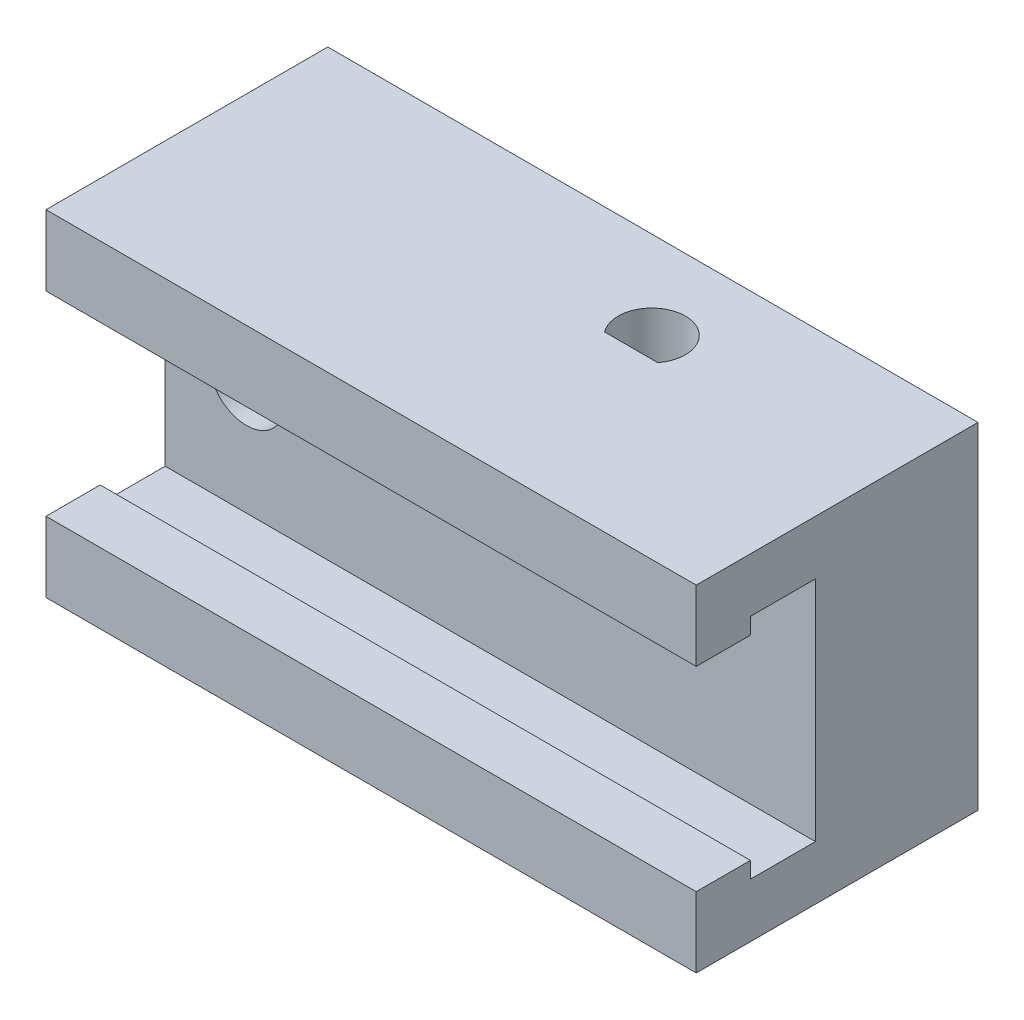
ISO-10303-21;
HEADER;
FILE_DESCRIPTION(('STEP AP214'),'2;1');
FILE_NAME('part.step','',(''),(''),'','','');
FILE_SCHEMA(('AUTOMOTIVE_DESIGN { 1 0 10303 214 1 1 1 1 }'));
ENDSEC;
DATA;
#1=APPLICATION_CONTEXT('core data for automotive mechanical design processes');
#2=APPLICATION_PROTOCOL_DEFINITION('international standard','automotive_design',2000,#1);
#3=PRODUCT_CONTEXT('',#1,'mechanical');
#4=PRODUCT('Part','Part','',(#3));
#5=PRODUCT_RELATED_PRODUCT_CATEGORY('part','',(#4));
#6=PRODUCT_DEFINITION_FORMATION('','',#4);
#7=PRODUCT_DEFINITION_CONTEXT('part definition',#1,'design');
#8=PRODUCT_DEFINITION('design','',#6,#7);
#9=PRODUCT_DEFINITION_SHAPE('','',#8);
#10=(LENGTH_UNIT() NAMED_UNIT(*) SI_UNIT(.MILLI.,.METRE.));
#11=(NAMED_UNIT(*) PLANE_ANGLE_UNIT() SI_UNIT($,.RADIAN.));
#12=(NAMED_UNIT(*) SI_UNIT($,.STERADIAN.) SOLID_ANGLE_UNIT());
#13=UNCERTAINTY_MEASURE_WITH_UNIT(LENGTH_MEASURE(1.E-05),#10,'distance_accuracy_value','');
#14=(GEOMETRIC_REPRESENTATION_CONTEXT(3) GLOBAL_UNCERTAINTY_ASSIGNED_CONTEXT((#13)) GLOBAL_UNIT_ASSIGNED_CONTEXT((#10,
#11,#12)) REPRESENTATION_CONTEXT('',''));
#15=CARTESIAN_POINT('',(0.,0.,0.));
#16=DIRECTION('',(0.,0.,1.));
#17=DIRECTION('',(1.,0.,0.));
#18=AXIS2_PLACEMENT_3D('',#15,#16,#17);
#19=CARTESIAN_POINT('',(-19.,15.5,8.95));
#20=DIRECTION('',(0.,0.,-1.));
#21=DIRECTION('',(-1.,0.,0.));
#22=AXIS2_PLACEMENT_3D('',#19,#20,#21);
#23=PLANE('',#22);
#24=DIRECTION('',(0.,-1.,0.));
#25=VECTOR('',#24,1.);
#26=CARTESIAN_POINT('',(11.,15.5,8.95));
#27=LINE('',#26,#25);
#28=CARTESIAN_POINT('',(11.,3.25,8.95));
#29=VERTEX_POINT('',#28);
#30=CARTESIAN_POINT('',(11.,0.,8.95));
#31=VERTEX_POINT('',#30);
#32=EDGE_CURVE('E167',#29,#31,#27,.T.);
#33=ORIENTED_EDGE('',*,*,#32,.F.);
#34=DIRECTION('',(-1.,0.,0.));
#35=VECTOR('',#34,1.);
#36=CARTESIAN_POINT('',(11.,3.25,8.95));
#37=LINE('',#36,#35);
#38=CARTESIAN_POINT('',(-19.,3.25,8.95));
#39=VERTEX_POINT('',#38);
#40=EDGE_CURVE('E222',#29,#39,#37,.T.);
#41=ORIENTED_EDGE('',*,*,#40,.T.);
#42=DIRECTION('',(0.,-1.,0.));
#43=VECTOR('',#42,1.);
#44=CARTESIAN_POINT('',(-19.,15.5,8.95));
#45=LINE('',#44,#43);
#46=CARTESIAN_POINT('',(-19.,0.,8.95));
#47=VERTEX_POINT('',#46);
#48=EDGE_CURVE('E49',#39,#47,#45,.T.);
#49=ORIENTED_EDGE('',*,*,#48,.T.);
#50=DIRECTION('',(1.,0.,0.));
#51=VECTOR('',#50,1.);
#52=CARTESIAN_POINT('',(-19.,0.,8.95));
#53=LINE('',#52,#51);
#54=EDGE_CURVE('E188',#47,#31,#53,.T.);
#55=ORIENTED_EDGE('',*,*,#54,.T.);
#56=EDGE_LOOP('',(#33,#41,#49,#55));
#57=FACE_BOUND('',#56,.T.);
#58=ADVANCED_FACE('F39',(#57),#23,.F.);
#59=CARTESIAN_POINT('',(0.,15.5,0.));
#60=DIRECTION('',(0.,1.,0.));
#61=DIRECTION('',(0.,0.,1.));
#62=AXIS2_PLACEMENT_3D('',#59,#60,#61);
#63=PLANE('',#62);
#64=DIRECTION('',(0.,0.,1.));
#65=VECTOR('',#64,1.);
#66=CARTESIAN_POINT('',(-19.,15.5,-4.05));
#67=LINE('',#66,#65);
#68=CARTESIAN_POINT('',(-19.,15.5,-4.05));
#69=VERTEX_POINT('',#68);
#70=CARTESIAN_POINT('',(-19.,15.5,8.95));
#71=VERTEX_POINT('',#70);
#72=EDGE_CURVE('E184',#69,#71,#67,.T.);
#73=ORIENTED_EDGE('',*,*,#72,.T.);
#74=DIRECTION('',(1.,0.,0.));
#75=VECTOR('',#74,1.);
#76=CARTESIAN_POINT('',(-19.,15.5,8.95));
#77=LINE('',#76,#75);
#78=CARTESIAN_POINT('',(11.,15.5,8.95));
#79=VERTEX_POINT('',#78);
#80=EDGE_CURVE('E200',#71,#79,#77,.T.);
#81=ORIENTED_EDGE('',*,*,#80,.T.);
#82=DIRECTION('',(0.,0.,-1.));
#83=VECTOR('',#82,1.);
#84=CARTESIAN_POINT('',(11.,15.5,-4.05));
#85=LINE('',#84,#83);
#86=CARTESIAN_POINT('',(11.,15.5,-4.05));
#87=VERTEX_POINT('',#86);
#88=EDGE_CURVE('E165',#79,#87,#85,.T.);
#89=ORIENTED_EDGE('',*,*,#88,.T.);
#90=DIRECTION('',(-1.,0.,0.));
#91=VECTOR('',#90,1.);
#92=CARTESIAN_POINT('',(-19.,15.5,-4.05));
#93=LINE('',#92,#91);
#94=EDGE_CURVE('E180',#87,#69,#93,.T.);
#95=ORIENTED_EDGE('',*,*,#94,.T.);
#96=EDGE_LOOP('',(#73,#81,#89,#95));
#97=FACE_BOUND('',#96,.T.);
#98=DIRECTION('',(1.,0.,0.));
#99=VECTOR('',#98,1.);
#100=CARTESIAN_POINT('',(-1.22474487139159,15.5,0.95));
#101=LINE('',#100,#99);
#102=CARTESIAN_POINT('',(-1.22474487139159,15.5,0.95));
#103=VERTEX_POINT('',#102);
#104=CARTESIAN_POINT('',(1.22474487139159,15.5,0.95));
#105=VERTEX_POINT('',#104);
#106=EDGE_CURVE('E212',#103,#105,#101,.T.);
#107=ORIENTED_EDGE('',*,*,#106,.F.);
#108=CARTESIAN_POINT('',(0.,15.5,0.));
#109=DIRECTION('',(0.,1.,0.));
#110=DIRECTION('',(0.,0.,1.));
#111=AXIS2_PLACEMENT_3D('',#108,#109,#110);
#112=CIRCLE('',#111,1.55);
#113=EDGE_CURVE('E217',#105,#103,#112,.T.);
#114=ORIENTED_EDGE('',*,*,#113,.F.);
#115=EDGE_LOOP('',(#107,#114));
#116=FACE_BOUND('',#115,.T.);
#117=ADVANCED_FACE('F314',(#97,#116),#63,.T.);
#118=CARTESIAN_POINT('',(0.,0.,0.));
#119=DIRECTION('',(0.,1.,0.));
#120=DIRECTION('',(0.,0.,1.));
#121=AXIS2_PLACEMENT_3D('',#118,#119,#120);
#122=PLANE('',#121);
#123=DIRECTION('',(0.,0.,1.));
#124=VECTOR('',#123,1.);
#125=CARTESIAN_POINT('',(-19.,0.,-4.05));
#126=LINE('',#125,#124);
#127=CARTESIAN_POINT('',(-19.,0.,-4.05));
#128=VERTEX_POINT('',#127);
#129=EDGE_CURVE('E192',#128,#47,#126,.T.);
#130=ORIENTED_EDGE('',*,*,#129,.F.);
#131=DIRECTION('',(-1.,0.,0.));
#132=VECTOR('',#131,1.);
#133=CARTESIAN_POINT('',(-19.,0.,-4.05));
#134=LINE('',#133,#132);
#135=CARTESIAN_POINT('',(11.,0.,-4.05));
#136=VERTEX_POINT('',#135);
#137=EDGE_CURVE('E181',#136,#128,#134,.T.);
#138=ORIENTED_EDGE('',*,*,#137,.F.);
#139=DIRECTION('',(0.,0.,-1.));
#140=VECTOR('',#139,1.);
#141=CARTESIAN_POINT('',(11.,0.,-4.05));
#142=LINE('',#141,#140);
#143=EDGE_CURVE('E185',#31,#136,#142,.T.);
#144=ORIENTED_EDGE('',*,*,#143,.F.);
#145=ORIENTED_EDGE('',*,*,#54,.F.);
#146=EDGE_LOOP('',(#130,#138,#144,#145));
#147=FACE_BOUND('',#146,.T.);
#148=CARTESIAN_POINT('',(0.,0.,0.));
#149=DIRECTION('',(0.,1.,0.));
#150=DIRECTION('',(0.,0.,1.));
#151=AXIS2_PLACEMENT_3D('',#148,#149,#150);
#152=CIRCLE('',#151,1.55);
#153=CARTESIAN_POINT('',(1.22474487139159,0.,0.95));
#154=VERTEX_POINT('',#153);
#155=CARTESIAN_POINT('',(-1.22474487139159,0.,0.95));
#156=VERTEX_POINT('',#155);
#157=EDGE_CURVE('E218',#154,#156,#152,.T.);
#158=ORIENTED_EDGE('',*,*,#157,.T.);
#159=DIRECTION('',(1.,0.,0.));
#160=VECTOR('',#159,1.);
#161=CARTESIAN_POINT('',(-1.22474487139159,0.,0.95));
#162=LINE('',#161,#160);
#163=EDGE_CURVE('E213',#156,#154,#162,.T.);
#164=ORIENTED_EDGE('',*,*,#163,.T.);
#165=EDGE_LOOP('',(#158,#164));
#166=FACE_BOUND('',#165,.T.);
#167=ADVANCED_FACE('F319',(#147,#166),#122,.F.);
#168=CARTESIAN_POINT('',(-19.,15.5,-4.05));
#169=DIRECTION('',(1.,0.,0.));
#170=DIRECTION('',(0.,0.,-1.));
#171=AXIS2_PLACEMENT_3D('',#168,#169,#170);
#172=PLANE('',#171);
#173=ORIENTED_EDGE('',*,*,#48,.F.);
#174=DIRECTION('',(0.,0.,1.));
#175=VECTOR('',#174,1.);
#176=CARTESIAN_POINT('',(-19.,3.25,6.45));
#177=LINE('',#176,#175);
#178=CARTESIAN_POINT('',(-19.,3.25,6.45));
#179=VERTEX_POINT('',#178);
#180=EDGE_CURVE('E151',#179,#39,#177,.T.);
#181=ORIENTED_EDGE('',*,*,#180,.F.);
#182=DIRECTION('',(0.,1.,0.));
#183=VECTOR('',#182,1.);
#184=CARTESIAN_POINT('',(-19.,2.5,6.45));
#185=LINE('',#184,#183);
#186=CARTESIAN_POINT('',(-19.,2.5,6.45));
#187=VERTEX_POINT('',#186);
#188=EDGE_CURVE('E249',#187,#179,#185,.T.);
#189=ORIENTED_EDGE('',*,*,#188,.F.);
#190=DIRECTION('',(0.,0.,1.));
#191=VECTOR('',#190,1.);
#192=CARTESIAN_POINT('',(-19.,2.5,3.45));
#193=LINE('',#192,#191);
#194=CARTESIAN_POINT('',(-19.,2.5,3.45));
#195=VERTEX_POINT('',#194);
#196=EDGE_CURVE('E253',#195,#187,#193,.T.);
#197=ORIENTED_EDGE('',*,*,#196,.F.);
#198=DIRECTION('',(0.,-1.,0.));
#199=VECTOR('',#198,1.);
#200=CARTESIAN_POINT('',(-19.,13.,3.45));
#201=LINE('',#200,#199);
#202=CARTESIAN_POINT('',(-19.,13.,3.45));
#203=VERTEX_POINT('',#202);
#204=EDGE_CURVE('E257',#203,#195,#201,.T.);
#205=ORIENTED_EDGE('',*,*,#204,.F.);
#206=DIRECTION('',(0.,0.,-1.));
#207=VECTOR('',#206,1.);
#208=CARTESIAN_POINT('',(-19.,13.,6.45));
#209=LINE('',#208,#207);
#210=CARTESIAN_POINT('',(-19.,13.,6.45));
#211=VERTEX_POINT('',#210);
#212=EDGE_CURVE('E261',#211,#203,#209,.T.);
#213=ORIENTED_EDGE('',*,*,#212,.F.);
#214=DIRECTION('',(0.,1.,0.));
#215=VECTOR('',#214,1.);
#216=CARTESIAN_POINT('',(-19.,12.25,6.45));
#217=LINE('',#216,#215);
#218=CARTESIAN_POINT('',(-19.,12.25,6.45));
#219=VERTEX_POINT('',#218);
#220=EDGE_CURVE('E265',#219,#211,#217,.T.);
#221=ORIENTED_EDGE('',*,*,#220,.F.);
#222=DIRECTION('',(0.,0.,-1.));
#223=VECTOR('',#222,1.);
#224=CARTESIAN_POINT('',(-19.,12.25,8.94999999999999));
#225=LINE('',#224,#223);
#226=CARTESIAN_POINT('',(-19.,12.25,8.94999999999999));
#227=VERTEX_POINT('',#226);
#228=EDGE_CURVE('E269',#227,#219,#225,.T.);
#229=ORIENTED_EDGE('',*,*,#228,.F.);
#230=EDGE_CURVE('E11',#71,#227,#45,.T.);
#231=ORIENTED_EDGE('',*,*,#230,.F.);
#232=ORIENTED_EDGE('',*,*,#72,.F.);
#233=DIRECTION('',(0.,-1.,0.));
#234=VECTOR('',#233,1.);
#235=CARTESIAN_POINT('',(-19.,15.5,-4.05));
#236=LINE('',#235,#234);
#237=EDGE_CURVE('E176',#69,#128,#236,.T.);
#238=ORIENTED_EDGE('',*,*,#237,.T.);
#239=ORIENTED_EDGE('',*,*,#129,.T.);
#240=EDGE_LOOP('',(#173,#181,#189,#197,#205,#213,#221,#229,#231,#232,#238,#239));
#241=FACE_BOUND('',#240,.T.);
#242=ADVANCED_FACE('F41',(#241),#172,.F.);
#243=ORIENTED_EDGE('',*,*,#230,.T.);
#244=DIRECTION('',(-1.,0.,0.));
#245=VECTOR('',#244,1.);
#246=CARTESIAN_POINT('',(11.,12.25,8.94999999999999));
#247=LINE('',#246,#245);
#248=CARTESIAN_POINT('',(11.,12.25,8.94999999999999));
#249=VERTEX_POINT('',#248);
#250=EDGE_CURVE('E145',#249,#227,#247,.T.);
#251=ORIENTED_EDGE('',*,*,#250,.F.);
#252=EDGE_CURVE('E156',#79,#249,#27,.T.);
#253=ORIENTED_EDGE('',*,*,#252,.F.);
#254=ORIENTED_EDGE('',*,*,#80,.F.);
#255=EDGE_LOOP('',(#243,#251,#253,#254));
#256=FACE_BOUND('',#255,.T.);
#257=ADVANCED_FACE('F155',(#256),#23,.F.);
#258=CARTESIAN_POINT('',(11.,15.5,-4.05));
#259=DIRECTION('',(-1.,0.,0.));
#260=DIRECTION('',(0.,0.,1.));
#261=AXIS2_PLACEMENT_3D('',#258,#259,#260);
#262=PLANE('',#261);
#263=DIRECTION('',(0.,1.,0.));
#264=VECTOR('',#263,1.);
#265=CARTESIAN_POINT('',(11.,2.5,6.45));
#266=LINE('',#265,#264);
#267=CARTESIAN_POINT('',(11.,2.5,6.45));
#268=VERTEX_POINT('',#267);
#269=CARTESIAN_POINT('',(11.,3.25,6.45));
#270=VERTEX_POINT('',#269);
#271=EDGE_CURVE('E275',#268,#270,#266,.T.);
#272=ORIENTED_EDGE('',*,*,#271,.T.);
#273=DIRECTION('',(0.,0.,1.));
#274=VECTOR('',#273,1.);
#275=CARTESIAN_POINT('',(11.,3.25,6.45));
#276=LINE('',#275,#274);
#277=EDGE_CURVE('E160',#270,#29,#276,.T.);
#278=ORIENTED_EDGE('',*,*,#277,.T.);
#279=ORIENTED_EDGE('',*,*,#32,.T.);
#280=ORIENTED_EDGE('',*,*,#143,.T.);
#281=DIRECTION('',(0.,-1.,0.));
#282=VECTOR('',#281,1.);
#283=CARTESIAN_POINT('',(11.,15.5,-4.05));
#284=LINE('',#283,#282);
#285=EDGE_CURVE('E171',#87,#136,#284,.T.);
#286=ORIENTED_EDGE('',*,*,#285,.F.);
#287=ORIENTED_EDGE('',*,*,#88,.F.);
#288=ORIENTED_EDGE('',*,*,#252,.T.);
#289=DIRECTION('',(0.,0.,-1.));
#290=VECTOR('',#289,1.);
#291=CARTESIAN_POINT('',(11.,12.25,8.94999999999999));
#292=LINE('',#291,#290);
#293=CARTESIAN_POINT('',(11.,12.25,6.45));
#294=VERTEX_POINT('',#293);
#295=EDGE_CURVE('E141',#249,#294,#292,.T.);
#296=ORIENTED_EDGE('',*,*,#295,.T.);
#297=DIRECTION('',(0.,1.,0.));
#298=VECTOR('',#297,1.);
#299=CARTESIAN_POINT('',(11.,12.25,6.45));
#300=LINE('',#299,#298);
#301=CARTESIAN_POINT('',(11.,13.,6.45));
#302=VERTEX_POINT('',#301);
#303=EDGE_CURVE('E56',#294,#302,#300,.T.);
#304=ORIENTED_EDGE('',*,*,#303,.T.);
#305=DIRECTION('',(0.,0.,-1.));
#306=VECTOR('',#305,1.);
#307=CARTESIAN_POINT('',(11.,13.,6.45));
#308=LINE('',#307,#306);
#309=CARTESIAN_POINT('',(11.,13.,3.45));
#310=VERTEX_POINT('',#309);
#311=EDGE_CURVE('E286',#302,#310,#308,.T.);
#312=ORIENTED_EDGE('',*,*,#311,.T.);
#313=DIRECTION('',(0.,-1.,0.));
#314=VECTOR('',#313,1.);
#315=CARTESIAN_POINT('',(11.,13.,3.45));
#316=LINE('',#315,#314);
#317=CARTESIAN_POINT('',(11.,2.5,3.45));
#318=VERTEX_POINT('',#317);
#319=EDGE_CURVE('E282',#310,#318,#316,.T.);
#320=ORIENTED_EDGE('',*,*,#319,.T.);
#321=DIRECTION('',(0.,0.,1.));
#322=VECTOR('',#321,1.);
#323=CARTESIAN_POINT('',(11.,2.5,3.45));
#324=LINE('',#323,#322);
#325=EDGE_CURVE('E278',#318,#268,#324,.T.);
#326=ORIENTED_EDGE('',*,*,#325,.T.);
#327=EDGE_LOOP('',(#272,#278,#279,#280,#286,#287,#288,#296,#304,#312,#320,#326));
#328=FACE_BOUND('',#327,.T.);
#329=ADVANCED_FACE('F163',(#328),#262,.F.);
#330=CARTESIAN_POINT('',(-19.,15.5,-4.05));
#331=DIRECTION('',(0.,0.,1.));
#332=DIRECTION('',(1.,0.,0.));
#333=AXIS2_PLACEMENT_3D('',#330,#331,#332);
#334=PLANE('',#333);
#335=CARTESIAN_POINT('',(-15.25,7.75,-4.05));
#336=DIRECTION('',(0.,0.,-1.));
#337=DIRECTION('',(-1.,0.,0.));
#338=AXIS2_PLACEMENT_3D('',#335,#336,#337);
#339=CIRCLE('',#338,1.75);
#340=CARTESIAN_POINT('',(-17.,7.75,-4.05));
#341=VERTEX_POINT('',#340);
#342=EDGE_CURVE('E292',#341,#341,#339,.T.);
#343=ORIENTED_EDGE('',*,*,#342,.F.);
#344=EDGE_LOOP('',(#343));
#345=FACE_BOUND('',#344,.T.);
#346=ORIENTED_EDGE('',*,*,#137,.T.);
#347=ORIENTED_EDGE('',*,*,#237,.F.);
#348=ORIENTED_EDGE('',*,*,#94,.F.);
#349=ORIENTED_EDGE('',*,*,#285,.T.);
#350=EDGE_LOOP('',(#346,#347,#348,#349));
#351=FACE_BOUND('',#350,.T.);
#352=ADVANCED_FACE('F329',(#345,#351),#334,.F.);
#353=CARTESIAN_POINT('',(0.,15.5,0.));
#354=DIRECTION('',(0.,-1.,0.));
#355=DIRECTION('',(0.,0.,-1.));
#356=AXIS2_PLACEMENT_3D('',#353,#354,#355);
#357=CYLINDRICAL_SURFACE('',#356,1.55);
#358=ORIENTED_EDGE('',*,*,#157,.F.);
#359=DIRECTION('',(0.,-1.,0.));
#360=VECTOR('',#359,1.);
#361=CARTESIAN_POINT('',(1.22474487139159,15.5,0.95));
#362=LINE('',#361,#360);
#363=EDGE_CURVE('E208',#105,#154,#362,.T.);
#364=ORIENTED_EDGE('',*,*,#363,.F.);
#365=ORIENTED_EDGE('',*,*,#113,.T.);
#366=DIRECTION('',(0.,-1.,0.));
#367=VECTOR('',#366,1.);
#368=CARTESIAN_POINT('',(-1.22474487139159,15.5,0.95));
#369=LINE('',#368,#367);
#370=EDGE_CURVE('E64',#103,#156,#369,.T.);
#371=ORIENTED_EDGE('',*,*,#370,.T.);
#372=EDGE_LOOP('',(#358,#364,#365,#371));
#373=FACE_BOUND('',#372,.T.);
#374=ADVANCED_FACE('F373',(#373),#357,.F.);
#375=CARTESIAN_POINT('',(-1.22474487139159,15.5,0.95));
#376=DIRECTION('',(0.,0.,-1.));
#377=DIRECTION('',(-1.,0.,0.));
#378=AXIS2_PLACEMENT_3D('',#375,#376,#377);
#379=PLANE('',#378);
#380=ORIENTED_EDGE('',*,*,#163,.F.);
#381=ORIENTED_EDGE('',*,*,#370,.F.);
#382=ORIENTED_EDGE('',*,*,#106,.T.);
#383=ORIENTED_EDGE('',*,*,#363,.T.);
#384=EDGE_LOOP('',(#380,#381,#382,#383));
#385=FACE_BOUND('',#384,.T.);
#386=ADVANCED_FACE('F367',(#385),#379,.T.);
#387=CARTESIAN_POINT('',(11.,3.25,6.45));
#388=DIRECTION('',(0.,-1.,0.));
#389=DIRECTION('',(0.,0.,-1.));
#390=AXIS2_PLACEMENT_3D('',#387,#388,#389);
#391=PLANE('',#390);
#392=ORIENTED_EDGE('',*,*,#180,.T.);
#393=ORIENTED_EDGE('',*,*,#40,.F.);
#394=ORIENTED_EDGE('',*,*,#277,.F.);
#395=DIRECTION('',(-1.,0.,0.));
#396=VECTOR('',#395,1.);
#397=CARTESIAN_POINT('',(11.,3.25,6.45));
#398=LINE('',#397,#396);
#399=EDGE_CURVE('E241',#270,#179,#398,.T.);
#400=ORIENTED_EDGE('',*,*,#399,.T.);
#401=EDGE_LOOP('',(#392,#393,#394,#400));
#402=FACE_BOUND('',#401,.T.);
#403=ADVANCED_FACE('F365',(#402),#391,.F.);
#404=CARTESIAN_POINT('',(11.,2.5,6.45));
#405=DIRECTION('',(0.,0.,1.));
#406=DIRECTION('',(1.,0.,0.));
#407=AXIS2_PLACEMENT_3D('',#404,#405,#406);
#408=PLANE('',#407);
#409=ORIENTED_EDGE('',*,*,#188,.T.);
#410=ORIENTED_EDGE('',*,*,#399,.F.);
#411=ORIENTED_EDGE('',*,*,#271,.F.);
#412=DIRECTION('',(-1.,0.,0.));
#413=VECTOR('',#412,1.);
#414=CARTESIAN_POINT('',(11.,2.5,6.45));
#415=LINE('',#414,#413);
#416=EDGE_CURVE('E238',#268,#187,#415,.T.);
#417=ORIENTED_EDGE('',*,*,#416,.T.);
#418=EDGE_LOOP('',(#409,#410,#411,#417));
#419=FACE_BOUND('',#418,.T.);
#420=ADVANCED_FACE('F362',(#419),#408,.F.);
#421=CARTESIAN_POINT('',(11.,2.5,3.45));
#422=DIRECTION('',(0.,-1.,0.));
#423=DIRECTION('',(0.,0.,-1.));
#424=AXIS2_PLACEMENT_3D('',#421,#422,#423);
#425=PLANE('',#424);
#426=ORIENTED_EDGE('',*,*,#196,.T.);
#427=ORIENTED_EDGE('',*,*,#416,.F.);
#428=ORIENTED_EDGE('',*,*,#325,.F.);
#429=DIRECTION('',(-1.,0.,0.));
#430=VECTOR('',#429,1.);
#431=CARTESIAN_POINT('',(11.,2.5,3.45));
#432=LINE('',#431,#430);
#433=EDGE_CURVE('E235',#318,#195,#432,.T.);
#434=ORIENTED_EDGE('',*,*,#433,.T.);
#435=EDGE_LOOP('',(#426,#427,#428,#434));
#436=FACE_BOUND('',#435,.T.);
#437=ADVANCED_FACE('F359',(#436),#425,.F.);
#438=CARTESIAN_POINT('',(11.,13.,3.45));
#439=DIRECTION('',(0.,0.,-1.));
#440=DIRECTION('',(0.,1.,0.));
#441=AXIS2_PLACEMENT_3D('',#438,#439,#440);
#442=PLANE('',#441);
#443=CARTESIAN_POINT('',(-15.25,7.75,3.45));
#444=DIRECTION('',(0.,0.,-1.));
#445=DIRECTION('',(0.,1.,0.));
#446=AXIS2_PLACEMENT_3D('',#443,#444,#445);
#447=CIRCLE('',#446,1.75);
#448=CARTESIAN_POINT('',(-15.25,9.5,3.45));
#449=VERTEX_POINT('',#448);
#450=EDGE_CURVE('E43',#449,#449,#447,.T.);
#451=ORIENTED_EDGE('',*,*,#450,.T.);
#452=EDGE_LOOP('',(#451));
#453=FACE_BOUND('',#452,.T.);
#454=ORIENTED_EDGE('',*,*,#204,.T.);
#455=ORIENTED_EDGE('',*,*,#433,.F.);
#456=ORIENTED_EDGE('',*,*,#319,.F.);
#457=DIRECTION('',(-1.,0.,0.));
#458=VECTOR('',#457,1.);
#459=CARTESIAN_POINT('',(11.,13.,3.45));
#460=LINE('',#459,#458);
#461=EDGE_CURVE('E232',#310,#203,#460,.T.);
#462=ORIENTED_EDGE('',*,*,#461,.T.);
#463=EDGE_LOOP('',(#454,#455,#456,#462));
#464=FACE_BOUND('',#463,.T.);
#465=ADVANCED_FACE('F301',(#453,#464),#442,.F.);
#466=CARTESIAN_POINT('',(11.,13.,6.45));
#467=DIRECTION('',(0.,1.,0.));
#468=DIRECTION('',(0.,0.,1.));
#469=AXIS2_PLACEMENT_3D('',#466,#467,#468);
#470=PLANE('',#469);
#471=ORIENTED_EDGE('',*,*,#212,.T.);
#472=ORIENTED_EDGE('',*,*,#461,.F.);
#473=ORIENTED_EDGE('',*,*,#311,.F.);
#474=DIRECTION('',(-1.,0.,0.));
#475=VECTOR('',#474,1.);
#476=CARTESIAN_POINT('',(11.,13.,6.45));
#477=LINE('',#476,#475);
#478=EDGE_CURVE('E229',#302,#211,#477,.T.);
#479=ORIENTED_EDGE('',*,*,#478,.T.);
#480=EDGE_LOOP('',(#471,#472,#473,#479));
#481=FACE_BOUND('',#480,.T.);
#482=ADVANCED_FACE('F354',(#481),#470,.F.);
#483=CARTESIAN_POINT('',(11.,12.25,6.45));
#484=DIRECTION('',(0.,0.,1.));
#485=DIRECTION('',(0.,-1.,0.));
#486=AXIS2_PLACEMENT_3D('',#483,#484,#485);
#487=PLANE('',#486);
#488=ORIENTED_EDGE('',*,*,#220,.T.);
#489=ORIENTED_EDGE('',*,*,#478,.F.);
#490=ORIENTED_EDGE('',*,*,#303,.F.);
#491=DIRECTION('',(-1.,0.,0.));
#492=VECTOR('',#491,1.);
#493=CARTESIAN_POINT('',(11.,12.25,6.45));
#494=LINE('',#493,#492);
#495=EDGE_CURVE('E147',#294,#219,#494,.T.);
#496=ORIENTED_EDGE('',*,*,#495,.T.);
#497=EDGE_LOOP('',(#488,#489,#490,#496));
#498=FACE_BOUND('',#497,.T.);
#499=ADVANCED_FACE('F310',(#498),#487,.F.);
#500=CARTESIAN_POINT('',(11.,12.25,8.94999999999999));
#501=DIRECTION('',(0.,1.,0.));
#502=DIRECTION('',(0.,0.,1.));
#503=AXIS2_PLACEMENT_3D('',#500,#501,#502);
#504=PLANE('',#503);
#505=ORIENTED_EDGE('',*,*,#228,.T.);
#506=ORIENTED_EDGE('',*,*,#495,.F.);
#507=ORIENTED_EDGE('',*,*,#295,.F.);
#508=ORIENTED_EDGE('',*,*,#250,.T.);
#509=EDGE_LOOP('',(#505,#506,#507,#508));
#510=FACE_BOUND('',#509,.T.);
#511=ADVANCED_FACE('F144',(#510),#504,.F.);
#512=CARTESIAN_POINT('',(-15.25,7.75,8.95));
#513=DIRECTION('',(0.,0.,-1.));
#514=DIRECTION('',(-1.,0.,0.));
#515=AXIS2_PLACEMENT_3D('',#512,#513,#514);
#516=CYLINDRICAL_SURFACE('',#515,1.75);
#517=ORIENTED_EDGE('',*,*,#342,.T.);
#518=EDGE_LOOP('',(#517));
#519=FACE_BOUND('',#518,.T.);
#520=ORIENTED_EDGE('',*,*,#450,.F.);
#521=EDGE_LOOP('',(#520));
#522=FACE_BOUND('',#521,.T.);
#523=ADVANCED_FACE('F304',(#519,#522),#516,.F.);
#524=CLOSED_SHELL('',(#58,#117,#167,#242,#257,#329,#352,#374,#386,#403,#420,#437,#465,#482,#499,
#511,#523));
#525=MANIFOLD_SOLID_BREP('B2',#524);
#526=ADVANCED_BREP_SHAPE_REPRESENTATION('',(#18,#525),#14);
#527=SHAPE_DEFINITION_REPRESENTATION(#9,#526);
ENDSEC;
END-ISO-10303-21;
